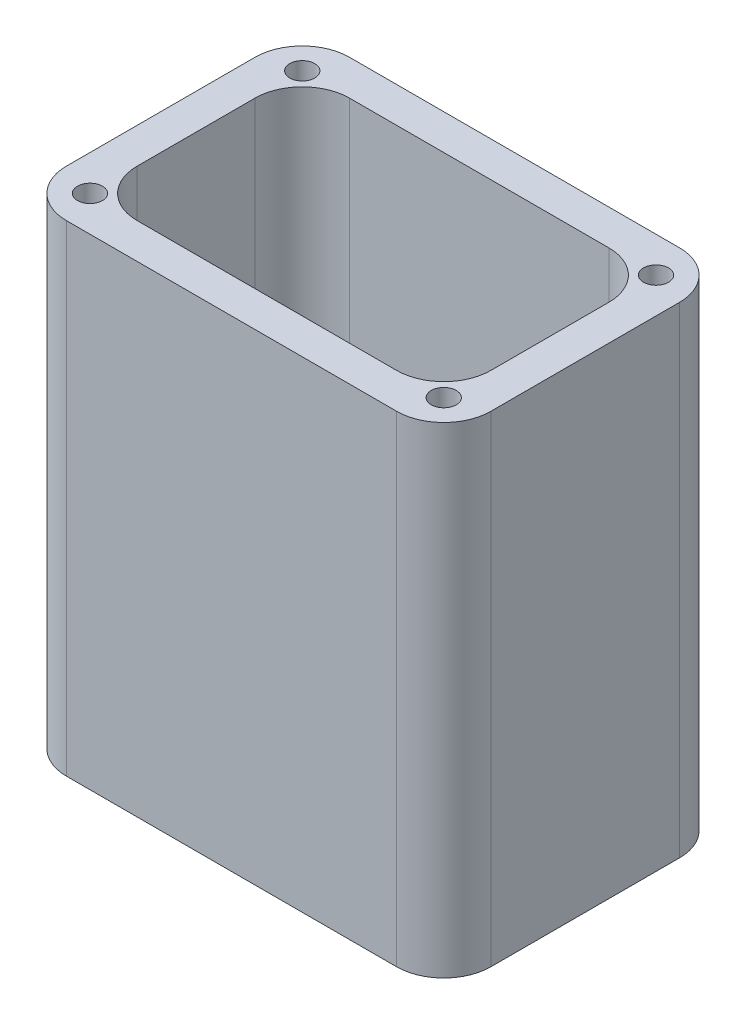
ISO-10303-21;
HEADER;
FILE_DESCRIPTION(('STEP AP214'),'2;1');
FILE_NAME('part.step','',(''),(''),'','','');
FILE_SCHEMA(('AUTOMOTIVE_DESIGN { 1 0 10303 214 1 1 1 1 }'));
ENDSEC;
DATA;
#1=APPLICATION_CONTEXT('core data for automotive mechanical design processes');
#2=APPLICATION_PROTOCOL_DEFINITION('international standard','automotive_design',2000,#1);
#3=PRODUCT_CONTEXT('',#1,'mechanical');
#4=PRODUCT('Part','Part','',(#3));
#5=PRODUCT_RELATED_PRODUCT_CATEGORY('part','',(#4));
#6=PRODUCT_DEFINITION_FORMATION('','',#4);
#7=PRODUCT_DEFINITION_CONTEXT('part definition',#1,'design');
#8=PRODUCT_DEFINITION('design','',#6,#7);
#9=PRODUCT_DEFINITION_SHAPE('','',#8);
#10=(LENGTH_UNIT() NAMED_UNIT(*) SI_UNIT(.MILLI.,.METRE.));
#11=(NAMED_UNIT(*) PLANE_ANGLE_UNIT() SI_UNIT($,.RADIAN.));
#12=(NAMED_UNIT(*) SI_UNIT($,.STERADIAN.) SOLID_ANGLE_UNIT());
#13=UNCERTAINTY_MEASURE_WITH_UNIT(LENGTH_MEASURE(1.E-05),#10,'distance_accuracy_value','');
#14=(GEOMETRIC_REPRESENTATION_CONTEXT(3) GLOBAL_UNCERTAINTY_ASSIGNED_CONTEXT((#13)) GLOBAL_UNIT_ASSIGNED_CONTEXT((#10,
#11,#12)) REPRESENTATION_CONTEXT('',''));
#15=CARTESIAN_POINT('',(0.,0.,0.));
#16=DIRECTION('',(0.,0.,1.));
#17=DIRECTION('',(1.,0.,0.));
#18=AXIS2_PLACEMENT_3D('',#15,#16,#17);
#19=CARTESIAN_POINT('',(35.,102.,20.));
#20=DIRECTION('',(0.,1.,0.));
#21=DIRECTION('',(0.,0.,1.));
#22=AXIS2_PLACEMENT_3D('',#19,#20,#21);
#23=PLANE('',#22);
#24=CARTESIAN_POINT('',(37.5,102.,22.5));
#25=DIRECTION('',(0.,1.,0.));
#26=DIRECTION('',(0.,0.,1.));
#27=AXIS2_PLACEMENT_3D('',#24,#25,#26);
#28=CIRCLE('',#27,2.65);
#29=CARTESIAN_POINT('',(37.5,102.,25.15));
#30=VERTEX_POINT('',#29);
#31=EDGE_CURVE('E254',#30,#30,#28,.T.);
#32=ORIENTED_EDGE('',*,*,#31,.F.);
#33=EDGE_LOOP('',(#32));
#34=FACE_BOUND('',#33,.T.);
#35=CARTESIAN_POINT('',(-37.5,102.,-22.5));
#36=DIRECTION('',(0.,1.,0.));
#37=DIRECTION('',(0.,0.,1.));
#38=AXIS2_PLACEMENT_3D('',#35,#36,#37);
#39=CIRCLE('',#38,2.65);
#40=CARTESIAN_POINT('',(-37.5,102.,-19.85));
#41=VERTEX_POINT('',#40);
#42=EDGE_CURVE('E270',#41,#41,#39,.T.);
#43=ORIENTED_EDGE('',*,*,#42,.F.);
#44=EDGE_LOOP('',(#43));
#45=FACE_BOUND('',#44,.T.);
#46=CARTESIAN_POINT('',(35.,102.,20.));
#47=DIRECTION('',(0.,1.,0.));
#48=DIRECTION('',(0.,0.,1.));
#49=AXIS2_PLACEMENT_3D('',#46,#47,#48);
#50=CIRCLE('',#49,10.);
#51=CARTESIAN_POINT('',(34.9999999999999,102.,30.));
#52=VERTEX_POINT('',#51);
#53=CARTESIAN_POINT('',(45.,102.,19.9999999999999));
#54=VERTEX_POINT('',#53);
#55=EDGE_CURVE('E278',#52,#54,#50,.T.);
#56=ORIENTED_EDGE('',*,*,#55,.T.);
#57=DIRECTION('',(0.,0.,-1.));
#58=VECTOR('',#57,1.);
#59=CARTESIAN_POINT('',(45.,102.,-19.9999999999999));
#60=LINE('',#59,#58);
#61=CARTESIAN_POINT('',(45.,102.,-19.9999999999999));
#62=VERTEX_POINT('',#61);
#63=EDGE_CURVE('E282',#54,#62,#60,.T.);
#64=ORIENTED_EDGE('',*,*,#63,.T.);
#65=CARTESIAN_POINT('',(35.,102.,-20.));
#66=DIRECTION('',(0.,1.,0.));
#67=DIRECTION('',(0.,0.,-1.));
#68=AXIS2_PLACEMENT_3D('',#65,#66,#67);
#69=CIRCLE('',#68,10.);
#70=CARTESIAN_POINT('',(34.9999999999999,102.,-30.));
#71=VERTEX_POINT('',#70);
#72=EDGE_CURVE('E286',#62,#71,#69,.T.);
#73=ORIENTED_EDGE('',*,*,#72,.T.);
#74=DIRECTION('',(-1.,0.,0.));
#75=VECTOR('',#74,1.);
#76=CARTESIAN_POINT('',(-34.9999999999999,102.,-30.));
#77=LINE('',#76,#75);
#78=CARTESIAN_POINT('',(-34.9999999999999,102.,-30.));
#79=VERTEX_POINT('',#78);
#80=EDGE_CURVE('E289',#71,#79,#77,.T.);
#81=ORIENTED_EDGE('',*,*,#80,.T.);
#82=CARTESIAN_POINT('',(-35.,102.,-20.));
#83=DIRECTION('',(0.,1.,0.));
#84=DIRECTION('',(0.,0.,1.));
#85=AXIS2_PLACEMENT_3D('',#82,#83,#84);
#86=CIRCLE('',#85,10.);
#87=CARTESIAN_POINT('',(-45.,102.,-19.9999999999999));
#88=VERTEX_POINT('',#87);
#89=EDGE_CURVE('E292',#79,#88,#86,.T.);
#90=ORIENTED_EDGE('',*,*,#89,.T.);
#91=DIRECTION('',(0.,0.,1.));
#92=VECTOR('',#91,1.);
#93=CARTESIAN_POINT('',(-45.,102.,-19.9999999999999));
#94=LINE('',#93,#92);
#95=CARTESIAN_POINT('',(-45.,102.,19.9999999999999));
#96=VERTEX_POINT('',#95);
#97=EDGE_CURVE('E295',#88,#96,#94,.T.);
#98=ORIENTED_EDGE('',*,*,#97,.T.);
#99=CARTESIAN_POINT('',(-35.,102.,20.));
#100=DIRECTION('',(0.,1.,0.));
#101=DIRECTION('',(0.,0.,1.));
#102=AXIS2_PLACEMENT_3D('',#99,#100,#101);
#103=CIRCLE('',#102,10.);
#104=CARTESIAN_POINT('',(-34.9999999999999,102.,30.));
#105=VERTEX_POINT('',#104);
#106=EDGE_CURVE('E298',#96,#105,#103,.T.);
#107=ORIENTED_EDGE('',*,*,#106,.T.);
#108=DIRECTION('',(1.,0.,0.));
#109=VECTOR('',#108,1.);
#110=CARTESIAN_POINT('',(-34.9999999999999,102.,30.));
#111=LINE('',#110,#109);
#112=EDGE_CURVE('E301',#105,#52,#111,.T.);
#113=ORIENTED_EDGE('',*,*,#112,.T.);
#114=EDGE_LOOP('',(#56,#64,#73,#81,#90,#98,#107,#113));
#115=FACE_BOUND('',#114,.T.);
#116=CARTESIAN_POINT('',(37.5,102.,-22.5));
#117=DIRECTION('',(0.,1.,0.));
#118=DIRECTION('',(0.,0.,-1.));
#119=AXIS2_PLACEMENT_3D('',#116,#117,#118);
#120=CIRCLE('',#119,2.65);
#121=CARTESIAN_POINT('',(37.5,102.,-25.15));
#122=VERTEX_POINT('',#121);
#123=EDGE_CURVE('E262',#122,#122,#120,.T.);
#124=ORIENTED_EDGE('',*,*,#123,.F.);
#125=EDGE_LOOP('',(#124));
#126=FACE_BOUND('',#125,.T.);
#127=CARTESIAN_POINT('',(-37.5,102.,22.5));
#128=DIRECTION('',(0.,1.,0.));
#129=DIRECTION('',(0.,0.,-1.));
#130=AXIS2_PLACEMENT_3D('',#127,#128,#129);
#131=CIRCLE('',#130,2.65);
#132=CARTESIAN_POINT('',(-37.5,102.,19.85));
#133=VERTEX_POINT('',#132);
#134=EDGE_CURVE('E246',#133,#133,#131,.T.);
#135=ORIENTED_EDGE('',*,*,#134,.F.);
#136=EDGE_LOOP('',(#135));
#137=FACE_BOUND('',#136,.T.);
#138=DIRECTION('',(-1.,0.,0.));
#139=VECTOR('',#138,1.);
#140=CARTESIAN_POINT('',(-27.4999999999999,102.,-22.5));
#141=LINE('',#140,#139);
#142=CARTESIAN_POINT('',(27.4999999999999,102.,-22.5));
#143=VERTEX_POINT('',#142);
#144=CARTESIAN_POINT('',(-27.4999999999999,102.,-22.5));
#145=VERTEX_POINT('',#144);
#146=EDGE_CURVE('E166',#143,#145,#141,.T.);
#147=ORIENTED_EDGE('',*,*,#146,.F.);
#148=CARTESIAN_POINT('',(27.5,102.,-12.5));
#149=DIRECTION('',(0.,1.,0.));
#150=DIRECTION('',(0.,0.,-1.));
#151=AXIS2_PLACEMENT_3D('',#148,#149,#150);
#152=CIRCLE('',#151,10.);
#153=CARTESIAN_POINT('',(37.5,102.,-12.4999999999999));
#154=VERTEX_POINT('',#153);
#155=EDGE_CURVE('E157',#154,#143,#152,.T.);
#156=ORIENTED_EDGE('',*,*,#155,.F.);
#157=DIRECTION('',(0.,0.,-1.));
#158=VECTOR('',#157,1.);
#159=CARTESIAN_POINT('',(37.5,102.,-12.4999999999999));
#160=LINE('',#159,#158);
#161=CARTESIAN_POINT('',(37.5,102.,12.4999999999999));
#162=VERTEX_POINT('',#161);
#163=EDGE_CURVE('E198',#162,#154,#160,.T.);
#164=ORIENTED_EDGE('',*,*,#163,.F.);
#165=CARTESIAN_POINT('',(27.5,102.,12.5));
#166=DIRECTION('',(0.,1.,0.));
#167=DIRECTION('',(0.,0.,1.));
#168=AXIS2_PLACEMENT_3D('',#165,#166,#167);
#169=CIRCLE('',#168,10.);
#170=CARTESIAN_POINT('',(27.4999999999999,102.,22.5));
#171=VERTEX_POINT('',#170);
#172=EDGE_CURVE('E195',#171,#162,#169,.T.);
#173=ORIENTED_EDGE('',*,*,#172,.F.);
#174=DIRECTION('',(1.,0.,0.));
#175=VECTOR('',#174,1.);
#176=CARTESIAN_POINT('',(-27.4999999999999,102.,22.5));
#177=LINE('',#176,#175);
#178=CARTESIAN_POINT('',(-27.5,102.,22.5));
#179=VERTEX_POINT('',#178);
#180=EDGE_CURVE('E192',#179,#171,#177,.T.);
#181=ORIENTED_EDGE('',*,*,#180,.F.);
#182=CARTESIAN_POINT('',(-27.5,102.,12.5));
#183=DIRECTION('',(0.,1.,0.));
#184=DIRECTION('',(0.,0.,1.));
#185=AXIS2_PLACEMENT_3D('',#182,#183,#184);
#186=CIRCLE('',#185,10.);
#187=CARTESIAN_POINT('',(-37.5,102.,12.4999999999999));
#188=VERTEX_POINT('',#187);
#189=EDGE_CURVE('E189',#188,#179,#186,.T.);
#190=ORIENTED_EDGE('',*,*,#189,.F.);
#191=DIRECTION('',(0.,0.,1.));
#192=VECTOR('',#191,1.);
#193=CARTESIAN_POINT('',(-37.5,102.,-12.4999999999999));
#194=LINE('',#193,#192);
#195=CARTESIAN_POINT('',(-37.5,102.,-12.4999999999999));
#196=VERTEX_POINT('',#195);
#197=EDGE_CURVE('E184',#196,#188,#194,.T.);
#198=ORIENTED_EDGE('',*,*,#197,.F.);
#199=CARTESIAN_POINT('',(-27.5,102.,-12.5));
#200=DIRECTION('',(0.,1.,0.));
#201=DIRECTION('',(0.,0.,1.));
#202=AXIS2_PLACEMENT_3D('',#199,#200,#201);
#203=CIRCLE('',#202,10.);
#204=EDGE_CURVE('E180',#145,#196,#203,.T.);
#205=ORIENTED_EDGE('',*,*,#204,.F.);
#206=EDGE_LOOP('',(#147,#156,#164,#173,#181,#190,#198,#205));
#207=FACE_BOUND('',#206,.T.);
#208=ADVANCED_FACE('F43',(#34,#45,#115,#126,#137,#207),#23,.T.);
#209=CARTESIAN_POINT('',(35.,0.,20.));
#210=DIRECTION('',(0.,1.,0.));
#211=DIRECTION('',(0.,0.,1.));
#212=AXIS2_PLACEMENT_3D('',#209,#210,#211);
#213=PLANE('',#212);
#214=CARTESIAN_POINT('',(-37.5,0.,22.5));
#215=DIRECTION('',(0.,1.,0.));
#216=DIRECTION('',(0.,0.,-1.));
#217=AXIS2_PLACEMENT_3D('',#214,#215,#216);
#218=CIRCLE('',#217,2.65);
#219=CARTESIAN_POINT('',(-37.5,0.,19.85));
#220=VERTEX_POINT('',#219);
#221=EDGE_CURVE('E175',#220,#220,#218,.T.);
#222=ORIENTED_EDGE('',*,*,#221,.T.);
#223=EDGE_LOOP('',(#222));
#224=FACE_BOUND('',#223,.T.);
#225=CARTESIAN_POINT('',(37.5,0.,22.5));
#226=DIRECTION('',(0.,1.,0.));
#227=DIRECTION('',(0.,0.,1.));
#228=AXIS2_PLACEMENT_3D('',#225,#226,#227);
#229=CIRCLE('',#228,2.65);
#230=CARTESIAN_POINT('',(37.5,0.,25.15));
#231=VERTEX_POINT('',#230);
#232=EDGE_CURVE('E250',#231,#231,#229,.T.);
#233=ORIENTED_EDGE('',*,*,#232,.T.);
#234=EDGE_LOOP('',(#233));
#235=FACE_BOUND('',#234,.T.);
#236=CARTESIAN_POINT('',(37.5,0.,-22.5));
#237=DIRECTION('',(0.,1.,0.));
#238=DIRECTION('',(0.,0.,-1.));
#239=AXIS2_PLACEMENT_3D('',#236,#237,#238);
#240=CIRCLE('',#239,2.65);
#241=CARTESIAN_POINT('',(37.5,0.,-25.15));
#242=VERTEX_POINT('',#241);
#243=EDGE_CURVE('E258',#242,#242,#240,.T.);
#244=ORIENTED_EDGE('',*,*,#243,.T.);
#245=EDGE_LOOP('',(#244));
#246=FACE_BOUND('',#245,.T.);
#247=CARTESIAN_POINT('',(-37.5,0.,-22.5));
#248=DIRECTION('',(0.,1.,0.));
#249=DIRECTION('',(0.,0.,1.));
#250=AXIS2_PLACEMENT_3D('',#247,#248,#249);
#251=CIRCLE('',#250,2.65);
#252=CARTESIAN_POINT('',(-37.5,0.,-19.85));
#253=VERTEX_POINT('',#252);
#254=EDGE_CURVE('E266',#253,#253,#251,.T.);
#255=ORIENTED_EDGE('',*,*,#254,.T.);
#256=EDGE_LOOP('',(#255));
#257=FACE_BOUND('',#256,.T.);
#258=CARTESIAN_POINT('',(35.,0.,20.));
#259=DIRECTION('',(0.,1.,0.));
#260=DIRECTION('',(0.,0.,1.));
#261=AXIS2_PLACEMENT_3D('',#258,#259,#260);
#262=CIRCLE('',#261,10.);
#263=CARTESIAN_POINT('',(34.9999999999999,0.,30.));
#264=VERTEX_POINT('',#263);
#265=CARTESIAN_POINT('',(45.,0.,19.9999999999999));
#266=VERTEX_POINT('',#265);
#267=EDGE_CURVE('E274',#264,#266,#262,.T.);
#268=ORIENTED_EDGE('',*,*,#267,.F.);
#269=DIRECTION('',(1.,0.,0.));
#270=VECTOR('',#269,1.);
#271=CARTESIAN_POINT('',(-34.9999999999999,0.,30.));
#272=LINE('',#271,#270);
#273=CARTESIAN_POINT('',(-34.9999999999999,0.,30.));
#274=VERTEX_POINT('',#273);
#275=EDGE_CURVE('E283',#274,#264,#272,.T.);
#276=ORIENTED_EDGE('',*,*,#275,.F.);
#277=CARTESIAN_POINT('',(-35.,0.,20.));
#278=DIRECTION('',(0.,1.,0.));
#279=DIRECTION('',(0.,0.,1.));
#280=AXIS2_PLACEMENT_3D('',#277,#278,#279);
#281=CIRCLE('',#280,10.);
#282=CARTESIAN_POINT('',(-45.,0.,19.9999999999999));
#283=VERTEX_POINT('',#282);
#284=EDGE_CURVE('E323',#283,#274,#281,.T.);
#285=ORIENTED_EDGE('',*,*,#284,.F.);
#286=DIRECTION('',(0.,0.,1.));
#287=VECTOR('',#286,1.);
#288=CARTESIAN_POINT('',(-45.,0.,-19.9999999999999));
#289=LINE('',#288,#287);
#290=CARTESIAN_POINT('',(-45.,0.,-19.9999999999999));
#291=VERTEX_POINT('',#290);
#292=EDGE_CURVE('E320',#291,#283,#289,.T.);
#293=ORIENTED_EDGE('',*,*,#292,.F.);
#294=CARTESIAN_POINT('',(-35.,0.,-20.));
#295=DIRECTION('',(0.,1.,0.));
#296=DIRECTION('',(0.,0.,1.));
#297=AXIS2_PLACEMENT_3D('',#294,#295,#296);
#298=CIRCLE('',#297,10.);
#299=CARTESIAN_POINT('',(-34.9999999999999,0.,-30.));
#300=VERTEX_POINT('',#299);
#301=EDGE_CURVE('E317',#300,#291,#298,.T.);
#302=ORIENTED_EDGE('',*,*,#301,.F.);
#303=DIRECTION('',(-1.,0.,0.));
#304=VECTOR('',#303,1.);
#305=CARTESIAN_POINT('',(-34.9999999999999,0.,-30.));
#306=LINE('',#305,#304);
#307=CARTESIAN_POINT('',(34.9999999999999,0.,-30.));
#308=VERTEX_POINT('',#307);
#309=EDGE_CURVE('E314',#308,#300,#306,.T.);
#310=ORIENTED_EDGE('',*,*,#309,.F.);
#311=CARTESIAN_POINT('',(35.,0.,-20.));
#312=DIRECTION('',(0.,1.,0.));
#313=DIRECTION('',(0.,0.,-1.));
#314=AXIS2_PLACEMENT_3D('',#311,#312,#313);
#315=CIRCLE('',#314,10.);
#316=CARTESIAN_POINT('',(45.,0.,-19.9999999999999));
#317=VERTEX_POINT('',#316);
#318=EDGE_CURVE('E311',#317,#308,#315,.T.);
#319=ORIENTED_EDGE('',*,*,#318,.F.);
#320=DIRECTION('',(0.,0.,-1.));
#321=VECTOR('',#320,1.);
#322=CARTESIAN_POINT('',(45.,0.,-19.9999999999999));
#323=LINE('',#322,#321);
#324=EDGE_CURVE('E308',#266,#317,#323,.T.);
#325=ORIENTED_EDGE('',*,*,#324,.F.);
#326=EDGE_LOOP('',(#268,#276,#285,#293,#302,#310,#319,#325));
#327=FACE_BOUND('',#326,.T.);
#328=CARTESIAN_POINT('',(27.5,0.,-12.5));
#329=DIRECTION('',(0.,1.,0.));
#330=DIRECTION('',(0.,0.,-1.));
#331=AXIS2_PLACEMENT_3D('',#328,#329,#330);
#332=CIRCLE('',#331,10.);
#333=CARTESIAN_POINT('',(37.5,0.,-12.4999999999999));
#334=VERTEX_POINT('',#333);
#335=CARTESIAN_POINT('',(27.4999999999999,0.,-22.5));
#336=VERTEX_POINT('',#335);
#337=EDGE_CURVE('E67',#334,#336,#332,.T.);
#338=ORIENTED_EDGE('',*,*,#337,.T.);
#339=DIRECTION('',(-1.,0.,0.));
#340=VECTOR('',#339,1.);
#341=CARTESIAN_POINT('',(-27.4999999999999,0.,-22.5));
#342=LINE('',#341,#340);
#343=CARTESIAN_POINT('',(-27.4999999999999,0.,-22.5));
#344=VERTEX_POINT('',#343);
#345=EDGE_CURVE('E173',#336,#344,#342,.T.);
#346=ORIENTED_EDGE('',*,*,#345,.T.);
#347=CARTESIAN_POINT('',(-27.5,0.,-12.5));
#348=DIRECTION('',(0.,1.,0.));
#349=DIRECTION('',(0.,0.,1.));
#350=AXIS2_PLACEMENT_3D('',#347,#348,#349);
#351=CIRCLE('',#350,10.);
#352=CARTESIAN_POINT('',(-37.5,0.,-12.4999999999999));
#353=VERTEX_POINT('',#352);
#354=EDGE_CURVE('E205',#344,#353,#351,.T.);
#355=ORIENTED_EDGE('',*,*,#354,.T.);
#356=DIRECTION('',(0.,0.,1.));
#357=VECTOR('',#356,1.);
#358=CARTESIAN_POINT('',(-37.5,0.,-12.4999999999999));
#359=LINE('',#358,#357);
#360=CARTESIAN_POINT('',(-37.5,0.,12.4999999999999));
#361=VERTEX_POINT('',#360);
#362=EDGE_CURVE('E209',#353,#361,#359,.T.);
#363=ORIENTED_EDGE('',*,*,#362,.T.);
#364=CARTESIAN_POINT('',(-27.5,0.,12.5));
#365=DIRECTION('',(0.,1.,0.));
#366=DIRECTION('',(0.,0.,1.));
#367=AXIS2_PLACEMENT_3D('',#364,#365,#366);
#368=CIRCLE('',#367,10.);
#369=CARTESIAN_POINT('',(-27.5,0.,22.5));
#370=VERTEX_POINT('',#369);
#371=EDGE_CURVE('E213',#361,#370,#368,.T.);
#372=ORIENTED_EDGE('',*,*,#371,.T.);
#373=DIRECTION('',(1.,0.,0.));
#374=VECTOR('',#373,1.);
#375=CARTESIAN_POINT('',(-27.4999999999999,0.,22.5));
#376=LINE('',#375,#374);
#377=CARTESIAN_POINT('',(27.4999999999999,0.,22.5));
#378=VERTEX_POINT('',#377);
#379=EDGE_CURVE('E217',#370,#378,#376,.T.);
#380=ORIENTED_EDGE('',*,*,#379,.T.);
#381=CARTESIAN_POINT('',(27.5,0.,12.5));
#382=DIRECTION('',(0.,1.,0.));
#383=DIRECTION('',(0.,0.,1.));
#384=AXIS2_PLACEMENT_3D('',#381,#382,#383);
#385=CIRCLE('',#384,10.);
#386=CARTESIAN_POINT('',(37.5,0.,12.4999999999999));
#387=VERTEX_POINT('',#386);
#388=EDGE_CURVE('E221',#378,#387,#385,.T.);
#389=ORIENTED_EDGE('',*,*,#388,.T.);
#390=DIRECTION('',(0.,0.,-1.));
#391=VECTOR('',#390,1.);
#392=CARTESIAN_POINT('',(37.5,0.,-12.4999999999999));
#393=LINE('',#392,#391);
#394=EDGE_CURVE('E167',#387,#334,#393,.T.);
#395=ORIENTED_EDGE('',*,*,#394,.T.);
#396=EDGE_LOOP('',(#338,#346,#355,#363,#372,#380,#389,#395));
#397=FACE_BOUND('',#396,.T.);
#398=ADVANCED_FACE('F362',(#224,#235,#246,#257,#327,#397),#213,.F.);
#399=CARTESIAN_POINT('',(35.,102.,20.));
#400=DIRECTION('',(0.,-1.,0.));
#401=DIRECTION('',(0.,0.,-1.));
#402=AXIS2_PLACEMENT_3D('',#399,#400,#401);
#403=CYLINDRICAL_SURFACE('',#402,10.);
#404=ORIENTED_EDGE('',*,*,#267,.T.);
#405=DIRECTION('',(0.,-1.,0.));
#406=VECTOR('',#405,1.);
#407=CARTESIAN_POINT('',(45.,102.,19.9999999999999));
#408=LINE('',#407,#406);
#409=EDGE_CURVE('E11',#54,#266,#408,.T.);
#410=ORIENTED_EDGE('',*,*,#409,.F.);
#411=ORIENTED_EDGE('',*,*,#55,.F.);
#412=DIRECTION('',(0.,-1.,0.));
#413=VECTOR('',#412,1.);
#414=CARTESIAN_POINT('',(34.9999999999999,102.,30.));
#415=LINE('',#414,#413);
#416=EDGE_CURVE('E304',#52,#264,#415,.T.);
#417=ORIENTED_EDGE('',*,*,#416,.T.);
#418=EDGE_LOOP('',(#404,#410,#411,#417));
#419=FACE_BOUND('',#418,.T.);
#420=ADVANCED_FACE('F45',(#419),#403,.T.);
#421=CARTESIAN_POINT('',(45.,102.,-19.9999999999999));
#422=DIRECTION('',(-1.,0.,0.));
#423=DIRECTION('',(0.,0.,1.));
#424=AXIS2_PLACEMENT_3D('',#421,#422,#423);
#425=PLANE('',#424);
#426=ORIENTED_EDGE('',*,*,#324,.T.);
#427=DIRECTION('',(0.,-1.,0.));
#428=VECTOR('',#427,1.);
#429=CARTESIAN_POINT('',(45.,102.,-19.9999999999999));
#430=LINE('',#429,#428);
#431=EDGE_CURVE('E52',#62,#317,#430,.T.);
#432=ORIENTED_EDGE('',*,*,#431,.F.);
#433=ORIENTED_EDGE('',*,*,#63,.F.);
#434=ORIENTED_EDGE('',*,*,#409,.T.);
#435=EDGE_LOOP('',(#426,#432,#433,#434));
#436=FACE_BOUND('',#435,.T.);
#437=ADVANCED_FACE('F380',(#436),#425,.F.);
#438=CARTESIAN_POINT('',(35.,102.,-20.));
#439=DIRECTION('',(0.,-1.,0.));
#440=DIRECTION('',(0.,0.,-1.));
#441=AXIS2_PLACEMENT_3D('',#438,#439,#440);
#442=CYLINDRICAL_SURFACE('',#441,10.);
#443=ORIENTED_EDGE('',*,*,#318,.T.);
#444=DIRECTION('',(0.,-1.,0.));
#445=VECTOR('',#444,1.);
#446=CARTESIAN_POINT('',(34.9999999999999,102.,-30.));
#447=LINE('',#446,#445);
#448=EDGE_CURVE('E347',#71,#308,#447,.T.);
#449=ORIENTED_EDGE('',*,*,#448,.F.);
#450=ORIENTED_EDGE('',*,*,#72,.F.);
#451=ORIENTED_EDGE('',*,*,#431,.T.);
#452=EDGE_LOOP('',(#443,#449,#450,#451));
#453=FACE_BOUND('',#452,.T.);
#454=ADVANCED_FACE('F356',(#453),#442,.T.);
#455=CARTESIAN_POINT('',(-34.9999999999999,102.,-30.));
#456=DIRECTION('',(0.,0.,1.));
#457=DIRECTION('',(1.,0.,0.));
#458=AXIS2_PLACEMENT_3D('',#455,#456,#457);
#459=PLANE('',#458);
#460=ORIENTED_EDGE('',*,*,#309,.T.);
#461=DIRECTION('',(0.,-1.,0.));
#462=VECTOR('',#461,1.);
#463=CARTESIAN_POINT('',(-34.9999999999999,102.,-30.));
#464=LINE('',#463,#462);
#465=EDGE_CURVE('E343',#79,#300,#464,.T.);
#466=ORIENTED_EDGE('',*,*,#465,.F.);
#467=ORIENTED_EDGE('',*,*,#80,.F.);
#468=ORIENTED_EDGE('',*,*,#448,.T.);
#469=EDGE_LOOP('',(#460,#466,#467,#468));
#470=FACE_BOUND('',#469,.T.);
#471=ADVANCED_FACE('F368',(#470),#459,.F.);
#472=CARTESIAN_POINT('',(-35.,102.,-20.));
#473=DIRECTION('',(0.,-1.,0.));
#474=DIRECTION('',(0.,0.,-1.));
#475=AXIS2_PLACEMENT_3D('',#472,#473,#474);
#476=CYLINDRICAL_SURFACE('',#475,10.);
#477=ORIENTED_EDGE('',*,*,#301,.T.);
#478=DIRECTION('',(0.,-1.,0.));
#479=VECTOR('',#478,1.);
#480=CARTESIAN_POINT('',(-45.,102.,-19.9999999999999));
#481=LINE('',#480,#479);
#482=EDGE_CURVE('E339',#88,#291,#481,.T.);
#483=ORIENTED_EDGE('',*,*,#482,.F.);
#484=ORIENTED_EDGE('',*,*,#89,.F.);
#485=ORIENTED_EDGE('',*,*,#465,.T.);
#486=EDGE_LOOP('',(#477,#483,#484,#485));
#487=FACE_BOUND('',#486,.T.);
#488=ADVANCED_FACE('F372',(#487),#476,.T.);
#489=CARTESIAN_POINT('',(-45.,102.,-19.9999999999999));
#490=DIRECTION('',(1.,0.,0.));
#491=DIRECTION('',(0.,0.,-1.));
#492=AXIS2_PLACEMENT_3D('',#489,#490,#491);
#493=PLANE('',#492);
#494=ORIENTED_EDGE('',*,*,#292,.T.);
#495=DIRECTION('',(0.,-1.,0.));
#496=VECTOR('',#495,1.);
#497=CARTESIAN_POINT('',(-45.,102.,19.9999999999999));
#498=LINE('',#497,#496);
#499=EDGE_CURVE('E335',#96,#283,#498,.T.);
#500=ORIENTED_EDGE('',*,*,#499,.F.);
#501=ORIENTED_EDGE('',*,*,#97,.F.);
#502=ORIENTED_EDGE('',*,*,#482,.T.);
#503=EDGE_LOOP('',(#494,#500,#501,#502));
#504=FACE_BOUND('',#503,.T.);
#505=ADVANCED_FACE('F393',(#504),#493,.F.);
#506=CARTESIAN_POINT('',(-35.,102.,20.));
#507=DIRECTION('',(0.,-1.,0.));
#508=DIRECTION('',(0.,0.,-1.));
#509=AXIS2_PLACEMENT_3D('',#506,#507,#508);
#510=CYLINDRICAL_SURFACE('',#509,10.);
#511=ORIENTED_EDGE('',*,*,#284,.T.);
#512=DIRECTION('',(0.,-1.,0.));
#513=VECTOR('',#512,1.);
#514=CARTESIAN_POINT('',(-34.9999999999999,102.,30.));
#515=LINE('',#514,#513);
#516=EDGE_CURVE('E331',#105,#274,#515,.T.);
#517=ORIENTED_EDGE('',*,*,#516,.F.);
#518=ORIENTED_EDGE('',*,*,#106,.F.);
#519=ORIENTED_EDGE('',*,*,#499,.T.);
#520=EDGE_LOOP('',(#511,#517,#518,#519));
#521=FACE_BOUND('',#520,.T.);
#522=ADVANCED_FACE('F391',(#521),#510,.T.);
#523=CARTESIAN_POINT('',(-34.9999999999999,102.,30.));
#524=DIRECTION('',(0.,0.,-1.));
#525=DIRECTION('',(-1.,0.,0.));
#526=AXIS2_PLACEMENT_3D('',#523,#524,#525);
#527=PLANE('',#526);
#528=ORIENTED_EDGE('',*,*,#275,.T.);
#529=ORIENTED_EDGE('',*,*,#416,.F.);
#530=ORIENTED_EDGE('',*,*,#112,.F.);
#531=ORIENTED_EDGE('',*,*,#516,.T.);
#532=EDGE_LOOP('',(#528,#529,#530,#531));
#533=FACE_BOUND('',#532,.T.);
#534=ADVANCED_FACE('F386',(#533),#527,.F.);
#535=CARTESIAN_POINT('',(-37.5,102.,-22.5));
#536=DIRECTION('',(0.,-1.,0.));
#537=DIRECTION('',(0.,0.,-1.));
#538=AXIS2_PLACEMENT_3D('',#535,#536,#537);
#539=CYLINDRICAL_SURFACE('',#538,2.65);
#540=ORIENTED_EDGE('',*,*,#42,.T.);
#541=EDGE_LOOP('',(#540));
#542=FACE_BOUND('',#541,.T.);
#543=ORIENTED_EDGE('',*,*,#254,.F.);
#544=EDGE_LOOP('',(#543));
#545=FACE_BOUND('',#544,.T.);
#546=ADVANCED_FACE('F413',(#542,#545),#539,.F.);
#547=CARTESIAN_POINT('',(37.5,102.,-22.5));
#548=DIRECTION('',(0.,-1.,0.));
#549=DIRECTION('',(0.,0.,-1.));
#550=AXIS2_PLACEMENT_3D('',#547,#548,#549);
#551=CYLINDRICAL_SURFACE('',#550,2.65);
#552=ORIENTED_EDGE('',*,*,#123,.T.);
#553=EDGE_LOOP('',(#552));
#554=FACE_BOUND('',#553,.T.);
#555=ORIENTED_EDGE('',*,*,#243,.F.);
#556=EDGE_LOOP('',(#555));
#557=FACE_BOUND('',#556,.T.);
#558=ADVANCED_FACE('F420',(#554,#557),#551,.F.);
#559=CARTESIAN_POINT('',(37.5,102.,22.5));
#560=DIRECTION('',(0.,-1.,0.));
#561=DIRECTION('',(0.,0.,-1.));
#562=AXIS2_PLACEMENT_3D('',#559,#560,#561);
#563=CYLINDRICAL_SURFACE('',#562,2.65);
#564=ORIENTED_EDGE('',*,*,#31,.T.);
#565=EDGE_LOOP('',(#564));
#566=FACE_BOUND('',#565,.T.);
#567=ORIENTED_EDGE('',*,*,#232,.F.);
#568=EDGE_LOOP('',(#567));
#569=FACE_BOUND('',#568,.T.);
#570=ADVANCED_FACE('F425',(#566,#569),#563,.F.);
#571=CARTESIAN_POINT('',(-37.5,102.,22.5));
#572=DIRECTION('',(0.,-1.,0.));
#573=DIRECTION('',(0.,0.,-1.));
#574=AXIS2_PLACEMENT_3D('',#571,#572,#573);
#575=CYLINDRICAL_SURFACE('',#574,2.65);
#576=ORIENTED_EDGE('',*,*,#134,.T.);
#577=EDGE_LOOP('',(#576));
#578=FACE_BOUND('',#577,.T.);
#579=ORIENTED_EDGE('',*,*,#221,.F.);
#580=EDGE_LOOP('',(#579));
#581=FACE_BOUND('',#580,.T.);
#582=ADVANCED_FACE('F434',(#578,#581),#575,.F.);
#583=CARTESIAN_POINT('',(27.5,102.,-12.5));
#584=DIRECTION('',(0.,-1.,0.));
#585=DIRECTION('',(0.,0.,-1.));
#586=AXIS2_PLACEMENT_3D('',#583,#584,#585);
#587=CYLINDRICAL_SURFACE('',#586,10.);
#588=ORIENTED_EDGE('',*,*,#337,.F.);
#589=DIRECTION('',(0.,-1.,0.));
#590=VECTOR('',#589,1.);
#591=CARTESIAN_POINT('',(37.5,102.,-12.4999999999999));
#592=LINE('',#591,#590);
#593=EDGE_CURVE('E161',#154,#334,#592,.T.);
#594=ORIENTED_EDGE('',*,*,#593,.F.);
#595=ORIENTED_EDGE('',*,*,#155,.T.);
#596=DIRECTION('',(0.,-1.,0.));
#597=VECTOR('',#596,1.);
#598=CARTESIAN_POINT('',(27.4999999999999,102.,-22.5));
#599=LINE('',#598,#597);
#600=EDGE_CURVE('E160',#143,#336,#599,.T.);
#601=ORIENTED_EDGE('',*,*,#600,.T.);
#602=EDGE_LOOP('',(#588,#594,#595,#601));
#603=FACE_BOUND('',#602,.T.);
#604=ADVANCED_FACE('F159',(#603),#587,.F.);
#605=CARTESIAN_POINT('',(-27.4999999999999,102.,-22.5));
#606=DIRECTION('',(0.,0.,1.));
#607=DIRECTION('',(1.,0.,0.));
#608=AXIS2_PLACEMENT_3D('',#605,#606,#607);
#609=PLANE('',#608);
#610=ORIENTED_EDGE('',*,*,#345,.F.);
#611=ORIENTED_EDGE('',*,*,#600,.F.);
#612=ORIENTED_EDGE('',*,*,#146,.T.);
#613=DIRECTION('',(0.,-1.,0.));
#614=VECTOR('',#613,1.);
#615=CARTESIAN_POINT('',(-27.4999999999999,102.,-22.5));
#616=LINE('',#615,#614);
#617=EDGE_CURVE('E176',#145,#344,#616,.T.);
#618=ORIENTED_EDGE('',*,*,#617,.T.);
#619=EDGE_LOOP('',(#610,#611,#612,#618));
#620=FACE_BOUND('',#619,.T.);
#621=ADVANCED_FACE('F170',(#620),#609,.T.);
#622=CARTESIAN_POINT('',(-27.5,102.,-12.5));
#623=DIRECTION('',(0.,-1.,0.));
#624=DIRECTION('',(0.,0.,-1.));
#625=AXIS2_PLACEMENT_3D('',#622,#623,#624);
#626=CYLINDRICAL_SURFACE('',#625,10.);
#627=ORIENTED_EDGE('',*,*,#354,.F.);
#628=ORIENTED_EDGE('',*,*,#617,.F.);
#629=ORIENTED_EDGE('',*,*,#204,.T.);
#630=DIRECTION('',(0.,-1.,0.));
#631=VECTOR('',#630,1.);
#632=CARTESIAN_POINT('',(-37.5,102.,-12.4999999999999));
#633=LINE('',#632,#631);
#634=EDGE_CURVE('E241',#196,#353,#633,.T.);
#635=ORIENTED_EDGE('',*,*,#634,.T.);
#636=EDGE_LOOP('',(#627,#628,#629,#635));
#637=FACE_BOUND('',#636,.T.);
#638=ADVANCED_FACE('F446',(#637),#626,.F.);
#639=CARTESIAN_POINT('',(-37.5,102.,-12.4999999999999));
#640=DIRECTION('',(1.,0.,0.));
#641=DIRECTION('',(0.,0.,-1.));
#642=AXIS2_PLACEMENT_3D('',#639,#640,#641);
#643=PLANE('',#642);
#644=ORIENTED_EDGE('',*,*,#362,.F.);
#645=ORIENTED_EDGE('',*,*,#634,.F.);
#646=ORIENTED_EDGE('',*,*,#197,.T.);
#647=DIRECTION('',(0.,-1.,0.));
#648=VECTOR('',#647,1.);
#649=CARTESIAN_POINT('',(-37.5,102.,12.4999999999999));
#650=LINE('',#649,#648);
#651=EDGE_CURVE('E238',#188,#361,#650,.T.);
#652=ORIENTED_EDGE('',*,*,#651,.T.);
#653=EDGE_LOOP('',(#644,#645,#646,#652));
#654=FACE_BOUND('',#653,.T.);
#655=ADVANCED_FACE('F449',(#654),#643,.T.);
#656=CARTESIAN_POINT('',(-27.5,102.,12.5));
#657=DIRECTION('',(0.,-1.,0.));
#658=DIRECTION('',(0.,0.,-1.));
#659=AXIS2_PLACEMENT_3D('',#656,#657,#658);
#660=CYLINDRICAL_SURFACE('',#659,10.);
#661=ORIENTED_EDGE('',*,*,#371,.F.);
#662=ORIENTED_EDGE('',*,*,#651,.F.);
#663=ORIENTED_EDGE('',*,*,#189,.T.);
#664=DIRECTION('',(0.,-1.,0.));
#665=VECTOR('',#664,1.);
#666=CARTESIAN_POINT('',(-27.5,102.,22.5));
#667=LINE('',#666,#665);
#668=EDGE_CURVE('E235',#179,#370,#667,.T.);
#669=ORIENTED_EDGE('',*,*,#668,.T.);
#670=EDGE_LOOP('',(#661,#662,#663,#669));
#671=FACE_BOUND('',#670,.T.);
#672=ADVANCED_FACE('F453',(#671),#660,.F.);
#673=CARTESIAN_POINT('',(-27.4999999999999,102.,22.5));
#674=DIRECTION('',(0.,0.,-1.));
#675=DIRECTION('',(-1.,0.,0.));
#676=AXIS2_PLACEMENT_3D('',#673,#674,#675);
#677=PLANE('',#676);
#678=ORIENTED_EDGE('',*,*,#379,.F.);
#679=ORIENTED_EDGE('',*,*,#668,.F.);
#680=ORIENTED_EDGE('',*,*,#180,.T.);
#681=DIRECTION('',(0.,-1.,0.));
#682=VECTOR('',#681,1.);
#683=CARTESIAN_POINT('',(27.4999999999999,102.,22.5));
#684=LINE('',#683,#682);
#685=EDGE_CURVE('E232',#171,#378,#684,.T.);
#686=ORIENTED_EDGE('',*,*,#685,.T.);
#687=EDGE_LOOP('',(#678,#679,#680,#686));
#688=FACE_BOUND('',#687,.T.);
#689=ADVANCED_FACE('F457',(#688),#677,.T.);
#690=CARTESIAN_POINT('',(27.5,102.,12.5));
#691=DIRECTION('',(0.,-1.,0.));
#692=DIRECTION('',(0.,0.,-1.));
#693=AXIS2_PLACEMENT_3D('',#690,#691,#692);
#694=CYLINDRICAL_SURFACE('',#693,10.);
#695=ORIENTED_EDGE('',*,*,#388,.F.);
#696=ORIENTED_EDGE('',*,*,#685,.F.);
#697=ORIENTED_EDGE('',*,*,#172,.T.);
#698=DIRECTION('',(0.,-1.,0.));
#699=VECTOR('',#698,1.);
#700=CARTESIAN_POINT('',(37.5,102.,12.4999999999999));
#701=LINE('',#700,#699);
#702=EDGE_CURVE('E59',#162,#387,#701,.T.);
#703=ORIENTED_EDGE('',*,*,#702,.T.);
#704=EDGE_LOOP('',(#695,#696,#697,#703));
#705=FACE_BOUND('',#704,.T.);
#706=ADVANCED_FACE('F461',(#705),#694,.F.);
#707=CARTESIAN_POINT('',(37.5,102.,-12.4999999999999));
#708=DIRECTION('',(-1.,0.,0.));
#709=DIRECTION('',(0.,0.,1.));
#710=AXIS2_PLACEMENT_3D('',#707,#708,#709);
#711=PLANE('',#710);
#712=ORIENTED_EDGE('',*,*,#394,.F.);
#713=ORIENTED_EDGE('',*,*,#702,.F.);
#714=ORIENTED_EDGE('',*,*,#163,.T.);
#715=ORIENTED_EDGE('',*,*,#593,.T.);
#716=EDGE_LOOP('',(#712,#713,#714,#715));
#717=FACE_BOUND('',#716,.T.);
#718=ADVANCED_FACE('F465',(#717),#711,.T.);
#719=CLOSED_SHELL('',(#208,#398,#420,#437,#454,#471,#488,#505,#522,#534,#546,#558,#570,#582,
#604,#621,#638,#655,#672,#689,#706,#718));
#720=MANIFOLD_SOLID_BREP('B2',#719);
#721=ADVANCED_BREP_SHAPE_REPRESENTATION('',(#18,#720),#14);
#722=SHAPE_DEFINITION_REPRESENTATION(#9,#721);
ENDSEC;
END-ISO-10303-21;
